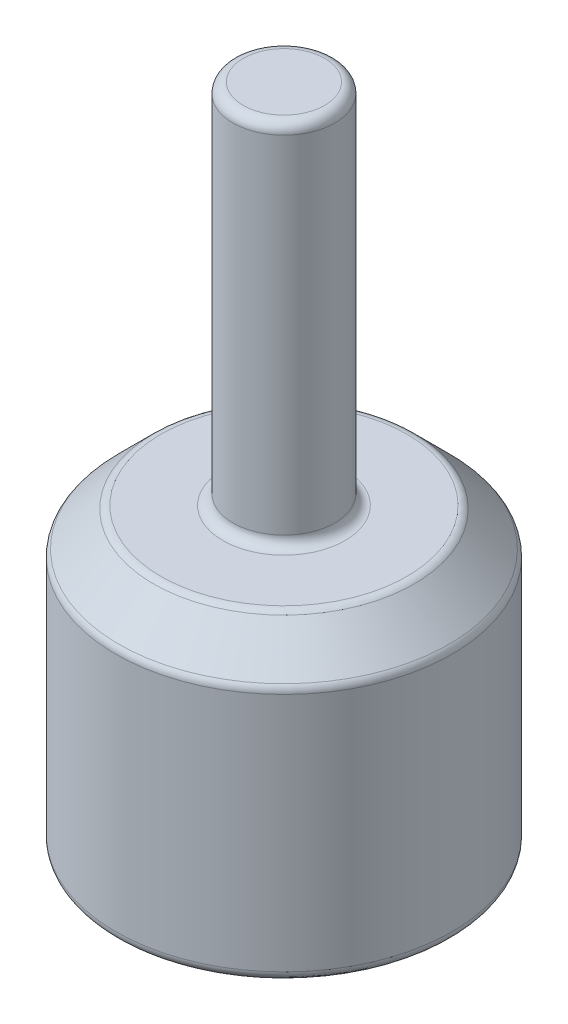
ISO-10303-21;
HEADER;
FILE_DESCRIPTION(('STEP AP214'),'2;1');
FILE_NAME('part.step','',(''),(''),'','','');
FILE_SCHEMA(('AUTOMOTIVE_DESIGN { 1 0 10303 214 1 1 1 1 }'));
ENDSEC;
DATA;
#1=APPLICATION_CONTEXT('core data for automotive mechanical design processes');
#2=APPLICATION_PROTOCOL_DEFINITION('international standard','automotive_design',2000,#1);
#3=PRODUCT_CONTEXT('',#1,'mechanical');
#4=PRODUCT('Part','Part','',(#3));
#5=PRODUCT_RELATED_PRODUCT_CATEGORY('part','',(#4));
#6=PRODUCT_DEFINITION_FORMATION('','',#4);
#7=PRODUCT_DEFINITION_CONTEXT('part definition',#1,'design');
#8=PRODUCT_DEFINITION('design','',#6,#7);
#9=PRODUCT_DEFINITION_SHAPE('','',#8);
#10=(LENGTH_UNIT() NAMED_UNIT(*) SI_UNIT(.MILLI.,.METRE.));
#11=(NAMED_UNIT(*) PLANE_ANGLE_UNIT() SI_UNIT($,.RADIAN.));
#12=(NAMED_UNIT(*) SI_UNIT($,.STERADIAN.) SOLID_ANGLE_UNIT());
#13=UNCERTAINTY_MEASURE_WITH_UNIT(LENGTH_MEASURE(1.E-05),#10,'distance_accuracy_value','');
#14=(GEOMETRIC_REPRESENTATION_CONTEXT(3) GLOBAL_UNCERTAINTY_ASSIGNED_CONTEXT((#13)) GLOBAL_UNIT_ASSIGNED_CONTEXT((#10,
#11,#12)) REPRESENTATION_CONTEXT('',''));
#15=CARTESIAN_POINT('',(0.,0.,0.));
#16=DIRECTION('',(0.,0.,1.));
#17=DIRECTION('',(1.,0.,0.));
#18=AXIS2_PLACEMENT_3D('',#15,#16,#17);
#19=CARTESIAN_POINT('',(0.,-32.,0.));
#20=DIRECTION('',(0.,1.,0.));
#21=DIRECTION('',(-1.,0.,0.));
#22=AXIS2_PLACEMENT_3D('',#19,#20,#21);
#23=TOROIDAL_SURFACE('',#22,7.75,0.5);
#24=CARTESIAN_POINT('',(0.,-32.5,0.));
#25=DIRECTION('',(0.,1.,0.));
#26=DIRECTION('',(-1.,0.,0.));
#27=AXIS2_PLACEMENT_3D('',#24,#25,#26);
#28=CIRCLE('',#27,7.74999999999999);
#29=CARTESIAN_POINT('',(-7.74999999999999,-32.5,0.));
#30=VERTEX_POINT('',#29);
#31=EDGE_CURVE('E86',#30,#30,#28,.T.);
#32=ORIENTED_EDGE('',*,*,#31,.T.);
#33=EDGE_LOOP('',(#32));
#34=FACE_BOUND('',#33,.T.);
#35=CARTESIAN_POINT('',(0.,-32.,0.));
#36=DIRECTION('',(0.,1.,0.));
#37=DIRECTION('',(-1.,0.,0.));
#38=AXIS2_PLACEMENT_3D('',#35,#36,#37);
#39=CIRCLE('',#38,8.25);
#40=CARTESIAN_POINT('',(-8.24999999999999,-32.,0.));
#41=VERTEX_POINT('',#40);
#42=EDGE_CURVE('E10',#41,#41,#39,.T.);
#43=ORIENTED_EDGE('',*,*,#42,.F.);
#44=EDGE_LOOP('',(#43));
#45=FACE_BOUND('',#44,.T.);
#46=ADVANCED_FACE('F39',(#34,#45),#23,.T.);
#47=CARTESIAN_POINT('',(0.,0.,0.));
#48=DIRECTION('',(0.,1.,0.));
#49=DIRECTION('',(-1.,0.,0.));
#50=AXIS2_PLACEMENT_3D('',#47,#48,#49);
#51=CYLINDRICAL_SURFACE('',#50,8.25);
#52=ORIENTED_EDGE('',*,*,#42,.T.);
#53=EDGE_LOOP('',(#52));
#54=FACE_BOUND('',#53,.T.);
#55=CARTESIAN_POINT('',(0.,-20.2071067811865,0.));
#56=DIRECTION('',(0.,1.,0.));
#57=DIRECTION('',(-1.,0.,0.));
#58=AXIS2_PLACEMENT_3D('',#55,#56,#57);
#59=CIRCLE('',#58,8.25);
#60=CARTESIAN_POINT('',(-8.24999999999999,-20.2071067811866,0.));
#61=VERTEX_POINT('',#60);
#62=EDGE_CURVE('E46',#61,#61,#59,.T.);
#63=ORIENTED_EDGE('',*,*,#62,.F.);
#64=EDGE_LOOP('',(#63));
#65=FACE_BOUND('',#64,.T.);
#66=ADVANCED_FACE('F105',(#54,#65),#51,.T.);
#67=CARTESIAN_POINT('',(0.,-20.2071067811865,0.));
#68=DIRECTION('',(0.,1.,0.));
#69=DIRECTION('',(-1.,0.,0.));
#70=AXIS2_PLACEMENT_3D('',#67,#68,#69);
#71=TOROIDAL_SURFACE('',#70,7.75,0.500000000000001);
#72=CARTESIAN_POINT('',(0.,-19.8535533905933,0.));
#73=DIRECTION('',(0.,1.,0.));
#74=DIRECTION('',(-1.,0.,0.));
#75=AXIS2_PLACEMENT_3D('',#72,#73,#74);
#76=CIRCLE('',#75,8.10355339059327);
#77=CARTESIAN_POINT('',(-8.10355339059327,-19.8535533905933,0.));
#78=VERTEX_POINT('',#77);
#79=EDGE_CURVE('E51',#78,#78,#76,.T.);
#80=ORIENTED_EDGE('',*,*,#79,.F.);
#81=EDGE_LOOP('',(#80));
#82=FACE_BOUND('',#81,.T.);
#83=ORIENTED_EDGE('',*,*,#62,.T.);
#84=EDGE_LOOP('',(#83));
#85=FACE_BOUND('',#84,.T.);
#86=ADVANCED_FACE('F109',(#82,#85),#71,.T.);
#87=CARTESIAN_POINT('',(0.,-18.1464466094067,0.));
#88=DIRECTION('',(0.,-1.,0.));
#89=DIRECTION('',(1.,0.,0.));
#90=AXIS2_PLACEMENT_3D('',#87,#88,#89);
#91=CONICAL_SURFACE('',#90,6.39644660940673,0.785398163397447);
#92=ORIENTED_EDGE('',*,*,#79,.T.);
#93=EDGE_LOOP('',(#92));
#94=FACE_BOUND('',#93,.T.);
#95=CARTESIAN_POINT('',(0.,-18.1464466094067,0.));
#96=DIRECTION('',(0.,1.,0.));
#97=DIRECTION('',(-1.,0.,0.));
#98=AXIS2_PLACEMENT_3D('',#95,#96,#97);
#99=CIRCLE('',#98,6.39644660940673);
#100=CARTESIAN_POINT('',(-6.39644660940672,-18.1464466094067,0.));
#101=VERTEX_POINT('',#100);
#102=EDGE_CURVE('E56',#101,#101,#99,.T.);
#103=ORIENTED_EDGE('',*,*,#102,.F.);
#104=EDGE_LOOP('',(#103));
#105=FACE_BOUND('',#104,.T.);
#106=ADVANCED_FACE('F113',(#94,#105),#91,.T.);
#107=CARTESIAN_POINT('',(0.,-18.5,0.));
#108=DIRECTION('',(0.,1.,0.));
#109=DIRECTION('',(-1.,0.,0.));
#110=AXIS2_PLACEMENT_3D('',#107,#108,#109);
#111=TOROIDAL_SURFACE('',#110,6.04289321881345,0.5);
#112=CARTESIAN_POINT('',(0.,-18.,0.));
#113=DIRECTION('',(0.,1.,0.));
#114=DIRECTION('',(-1.,0.,0.));
#115=AXIS2_PLACEMENT_3D('',#112,#113,#114);
#116=CIRCLE('',#115,6.04289321881345);
#117=CARTESIAN_POINT('',(-6.04289321881345,-18.,0.));
#118=VERTEX_POINT('',#117);
#119=EDGE_CURVE('E62',#118,#118,#116,.T.);
#120=ORIENTED_EDGE('',*,*,#119,.F.);
#121=EDGE_LOOP('',(#120));
#122=FACE_BOUND('',#121,.T.);
#123=ORIENTED_EDGE('',*,*,#102,.T.);
#124=EDGE_LOOP('',(#123));
#125=FACE_BOUND('',#124,.T.);
#126=ADVANCED_FACE('F120',(#122,#125),#111,.T.);
#127=CARTESIAN_POINT('',(0.,-18.,0.));
#128=DIRECTION('',(0.,1.,0.));
#129=DIRECTION('',(-1.,0.,0.));
#130=AXIS2_PLACEMENT_3D('',#127,#128,#129);
#131=PLANE('',#130);
#132=ORIENTED_EDGE('',*,*,#119,.T.);
#133=EDGE_LOOP('',(#132));
#134=FACE_BOUND('',#133,.T.);
#135=CARTESIAN_POINT('',(0.,-18.,0.));
#136=DIRECTION('',(0.,1.,0.));
#137=DIRECTION('',(-1.,0.,0.));
#138=AXIS2_PLACEMENT_3D('',#135,#136,#137);
#139=CIRCLE('',#138,3.);
#140=CARTESIAN_POINT('',(-3.,-18.,0.));
#141=VERTEX_POINT('',#140);
#142=EDGE_CURVE('E66',#141,#141,#139,.T.);
#143=ORIENTED_EDGE('',*,*,#142,.F.);
#144=EDGE_LOOP('',(#143));
#145=FACE_BOUND('',#144,.T.);
#146=ADVANCED_FACE('F124',(#134,#145),#131,.T.);
#147=CARTESIAN_POINT('',(0.,-17.5,0.));
#148=DIRECTION('',(0.,1.,0.));
#149=DIRECTION('',(-1.,0.,0.));
#150=AXIS2_PLACEMENT_3D('',#147,#148,#149);
#151=TOROIDAL_SURFACE('',#150,3.,0.5);
#152=CARTESIAN_POINT('',(0.,-17.5,0.));
#153=DIRECTION('',(0.,1.,0.));
#154=DIRECTION('',(-1.,0.,0.));
#155=AXIS2_PLACEMENT_3D('',#152,#153,#154);
#156=CIRCLE('',#155,2.5);
#157=CARTESIAN_POINT('',(-2.49999999999999,-17.5,0.));
#158=VERTEX_POINT('',#157);
#159=EDGE_CURVE('E70',#158,#158,#156,.T.);
#160=ORIENTED_EDGE('',*,*,#159,.F.);
#161=EDGE_LOOP('',(#160));
#162=FACE_BOUND('',#161,.T.);
#163=ORIENTED_EDGE('',*,*,#142,.T.);
#164=EDGE_LOOP('',(#163));
#165=FACE_BOUND('',#164,.T.);
#166=ADVANCED_FACE('F128',(#162,#165),#151,.F.);
#167=CARTESIAN_POINT('',(0.,0.,0.));
#168=DIRECTION('',(0.,1.,0.));
#169=DIRECTION('',(-1.,0.,0.));
#170=AXIS2_PLACEMENT_3D('',#167,#168,#169);
#171=CYLINDRICAL_SURFACE('',#170,2.5);
#172=ORIENTED_EDGE('',*,*,#159,.T.);
#173=EDGE_LOOP('',(#172));
#174=FACE_BOUND('',#173,.T.);
#175=CARTESIAN_POINT('',(0.,-0.500000000000004,0.));
#176=DIRECTION('',(0.,1.,0.));
#177=DIRECTION('',(-1.,0.,0.));
#178=AXIS2_PLACEMENT_3D('',#175,#176,#177);
#179=CIRCLE('',#178,2.5);
#180=CARTESIAN_POINT('',(-2.5,-0.500000000000005,0.));
#181=VERTEX_POINT('',#180);
#182=EDGE_CURVE('E74',#181,#181,#179,.T.);
#183=ORIENTED_EDGE('',*,*,#182,.F.);
#184=EDGE_LOOP('',(#183));
#185=FACE_BOUND('',#184,.T.);
#186=ADVANCED_FACE('F132',(#174,#185),#171,.T.);
#187=CARTESIAN_POINT('',(0.,-0.5,0.));
#188=DIRECTION('',(0.,1.,0.));
#189=DIRECTION('',(-1.,0.,0.));
#190=AXIS2_PLACEMENT_3D('',#187,#188,#189);
#191=TOROIDAL_SURFACE('',#190,2.,0.5);
#192=CARTESIAN_POINT('',(0.,0.,0.));
#193=DIRECTION('',(0.,1.,0.));
#194=DIRECTION('',(-1.,0.,0.));
#195=AXIS2_PLACEMENT_3D('',#192,#193,#194);
#196=CIRCLE('',#195,2.);
#197=CARTESIAN_POINT('',(-2.,0.,0.));
#198=VERTEX_POINT('',#197);
#199=EDGE_CURVE('E78',#198,#198,#196,.T.);
#200=ORIENTED_EDGE('',*,*,#199,.F.);
#201=EDGE_LOOP('',(#200));
#202=FACE_BOUND('',#201,.T.);
#203=ORIENTED_EDGE('',*,*,#182,.T.);
#204=EDGE_LOOP('',(#203));
#205=FACE_BOUND('',#204,.T.);
#206=ADVANCED_FACE('F136',(#202,#205),#191,.T.);
#207=CARTESIAN_POINT('',(0.,0.,0.));
#208=DIRECTION('',(0.,1.,0.));
#209=DIRECTION('',(-1.,0.,0.));
#210=AXIS2_PLACEMENT_3D('',#207,#208,#209);
#211=PLANE('',#210);
#212=ORIENTED_EDGE('',*,*,#199,.T.);
#213=EDGE_LOOP('',(#212));
#214=FACE_BOUND('',#213,.T.);
#215=ADVANCED_FACE('F101',(#214),#211,.T.);
#216=CARTESIAN_POINT('',(0.,-23.2375,0.));
#217=DIRECTION('',(0.,1.,0.));
#218=DIRECTION('',(1.,0.,0.));
#219=AXIS2_PLACEMENT_3D('',#216,#217,#218);
#220=SPHERICAL_SURFACE('',#219,11.7625);
#221=CARTESIAN_POINT('',(0.,-32.5,0.));
#222=DIRECTION('',(0.,1.,0.));
#223=DIRECTION('',(-1.,0.,0.));
#224=AXIS2_PLACEMENT_3D('',#221,#222,#223);
#225=CIRCLE('',#224,7.25);
#226=CARTESIAN_POINT('',(-7.24999999999999,-32.5,0.));
#227=VERTEX_POINT('',#226);
#228=EDGE_CURVE('E82',#227,#227,#225,.T.);
#229=ORIENTED_EDGE('',*,*,#228,.F.);
#230=EDGE_LOOP('',(#229));
#231=FACE_BOUND('',#230,.T.);
#232=ADVANCED_FACE('F95',(#231),#220,.T.);
#233=CARTESIAN_POINT('',(0.,-32.5,0.));
#234=DIRECTION('',(0.,-1.,0.));
#235=DIRECTION('',(1.,0.,0.));
#236=AXIS2_PLACEMENT_3D('',#233,#234,#235);
#237=PLANE('',#236);
#238=ORIENTED_EDGE('',*,*,#228,.T.);
#239=EDGE_LOOP('',(#238));
#240=FACE_BOUND('',#239,.T.);
#241=ORIENTED_EDGE('',*,*,#31,.F.);
#242=EDGE_LOOP('',(#241));
#243=FACE_BOUND('',#242,.T.);
#244=ADVANCED_FACE('F93',(#240,#243),#237,.T.);
#245=CLOSED_SHELL('',(#46,#66,#86,#106,#126,#146,#166,#186,#206,#215,#232,#244));
#246=MANIFOLD_SOLID_BREP('B2',#245);
#247=ADVANCED_BREP_SHAPE_REPRESENTATION('',(#18,#246),#14);
#248=SHAPE_DEFINITION_REPRESENTATION(#9,#247);
ENDSEC;
END-ISO-10303-21;
